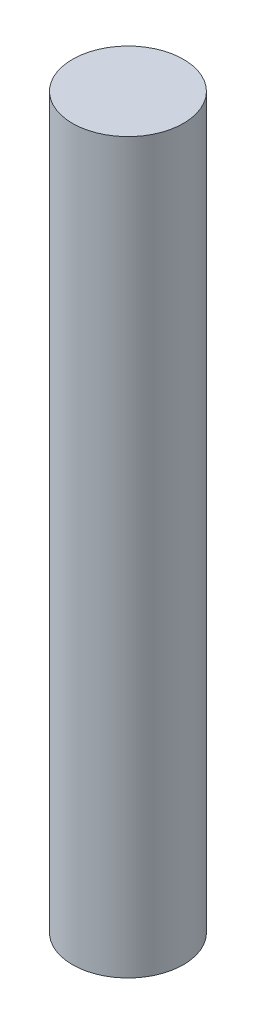
ISO-10303-21;
HEADER;
FILE_DESCRIPTION(('STEP AP214'),'2;1');
FILE_NAME('part.step','',(''),(''),'','','');
FILE_SCHEMA(('AUTOMOTIVE_DESIGN { 1 0 10303 214 1 1 1 1 }'));
ENDSEC;
DATA;
#1=APPLICATION_CONTEXT('core data for automotive mechanical design processes');
#2=APPLICATION_PROTOCOL_DEFINITION('international standard','automotive_design',2000,#1);
#3=PRODUCT_CONTEXT('',#1,'mechanical');
#4=PRODUCT('Part','Part','',(#3));
#5=PRODUCT_RELATED_PRODUCT_CATEGORY('part','',(#4));
#6=PRODUCT_DEFINITION_FORMATION('','',#4);
#7=PRODUCT_DEFINITION_CONTEXT('part definition',#1,'design');
#8=PRODUCT_DEFINITION('design','',#6,#7);
#9=PRODUCT_DEFINITION_SHAPE('','',#8);
#10=(LENGTH_UNIT() NAMED_UNIT(*) SI_UNIT(.MILLI.,.METRE.));
#11=(NAMED_UNIT(*) PLANE_ANGLE_UNIT() SI_UNIT($,.RADIAN.));
#12=(NAMED_UNIT(*) SI_UNIT($,.STERADIAN.) SOLID_ANGLE_UNIT());
#13=UNCERTAINTY_MEASURE_WITH_UNIT(LENGTH_MEASURE(1.E-05),#10,'distance_accuracy_value','');
#14=(GEOMETRIC_REPRESENTATION_CONTEXT(3) GLOBAL_UNCERTAINTY_ASSIGNED_CONTEXT((#13)) GLOBAL_UNIT_ASSIGNED_CONTEXT((#10,
#11,#12)) REPRESENTATION_CONTEXT('',''));
#15=CARTESIAN_POINT('',(0.,0.,0.));
#16=DIRECTION('',(0.,0.,1.));
#17=DIRECTION('',(1.,0.,0.));
#18=AXIS2_PLACEMENT_3D('',#15,#16,#17);
#19=CARTESIAN_POINT('',(0.,-361.,0.));
#20=DIRECTION('',(0.,1.,0.));
#21=DIRECTION('',(0.,0.,1.));
#22=AXIS2_PLACEMENT_3D('',#19,#20,#21);
#23=CYLINDRICAL_SURFACE('',#22,27.5);
#24=CARTESIAN_POINT('',(0.,-361.,0.));
#25=DIRECTION('',(0.,1.,0.));
#26=DIRECTION('',(0.,0.,1.));
#27=AXIS2_PLACEMENT_3D('',#24,#25,#26);
#28=CIRCLE('',#27,27.5);
#29=CARTESIAN_POINT('',(0.,-361.,27.5));
#30=VERTEX_POINT('',#29);
#31=EDGE_CURVE('E10',#30,#30,#28,.T.);
#32=ORIENTED_EDGE('',*,*,#31,.T.);
#33=EDGE_LOOP('',(#32));
#34=FACE_BOUND('',#33,.T.);
#35=CARTESIAN_POINT('',(0.,0.,0.));
#36=DIRECTION('',(0.,1.,0.));
#37=DIRECTION('',(0.,0.,1.));
#38=AXIS2_PLACEMENT_3D('',#35,#36,#37);
#39=CIRCLE('',#38,27.5);
#40=CARTESIAN_POINT('',(0.,0.,27.5));
#41=VERTEX_POINT('',#40);
#42=EDGE_CURVE('E40',#41,#41,#39,.T.);
#43=ORIENTED_EDGE('',*,*,#42,.F.);
#44=EDGE_LOOP('',(#43));
#45=FACE_BOUND('',#44,.T.);
#46=ADVANCED_FACE('F37',(#34,#45),#23,.T.);
#47=CARTESIAN_POINT('',(0.,-361.,0.));
#48=DIRECTION('',(0.,1.,0.));
#49=DIRECTION('',(0.,0.,1.));
#50=AXIS2_PLACEMENT_3D('',#47,#48,#49);
#51=PLANE('',#50);
#52=ORIENTED_EDGE('',*,*,#31,.F.);
#53=EDGE_LOOP('',(#52));
#54=FACE_BOUND('',#53,.T.);
#55=ADVANCED_FACE('F54',(#54),#51,.F.);
#56=CARTESIAN_POINT('',(0.,0.,0.));
#57=DIRECTION('',(0.,1.,0.));
#58=DIRECTION('',(0.,0.,1.));
#59=AXIS2_PLACEMENT_3D('',#56,#57,#58);
#60=PLANE('',#59);
#61=ORIENTED_EDGE('',*,*,#42,.T.);
#62=EDGE_LOOP('',(#61));
#63=FACE_BOUND('',#62,.T.);
#64=ADVANCED_FACE('F51',(#63),#60,.T.);
#65=CLOSED_SHELL('',(#46,#55,#64));
#66=MANIFOLD_SOLID_BREP('B2',#65);
#67=ADVANCED_BREP_SHAPE_REPRESENTATION('',(#18,#66),#14);
#68=SHAPE_DEFINITION_REPRESENTATION(#9,#67);
ENDSEC;
END-ISO-10303-21;
